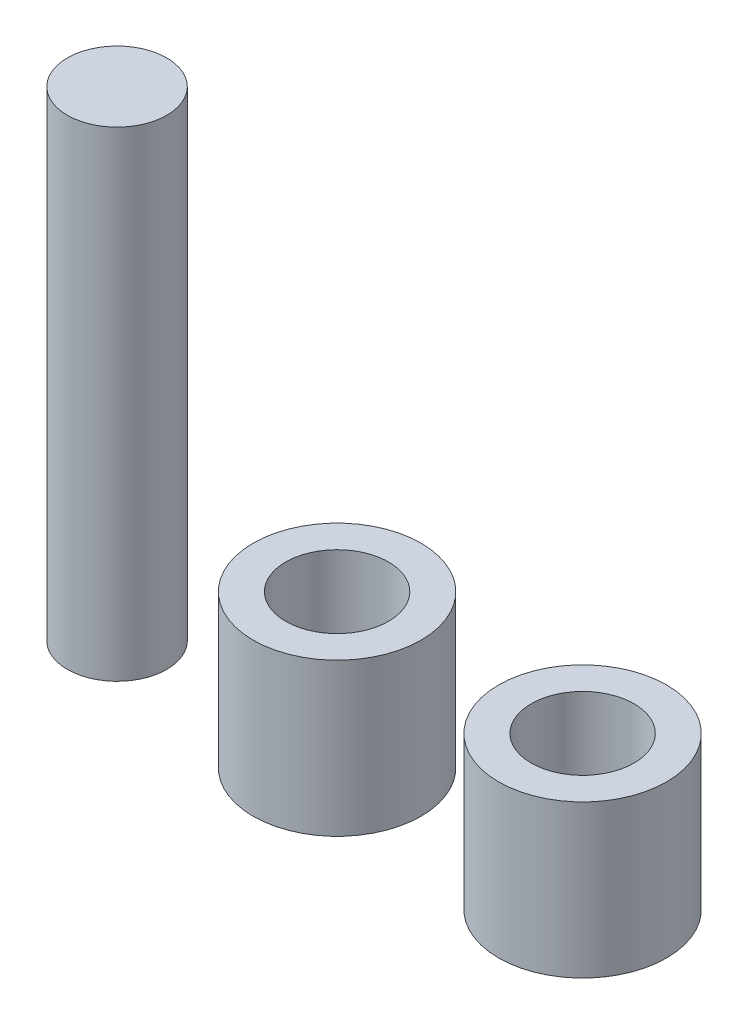
ISO-10303-21;
HEADER;
FILE_DESCRIPTION(('STEP AP214'),'2;1');
FILE_NAME('part.step','',(''),(''),'','','');
FILE_SCHEMA(('AUTOMOTIVE_DESIGN { 1 0 10303 214 1 1 1 1 }'));
ENDSEC;
DATA;
#1=APPLICATION_CONTEXT('core data for automotive mechanical design processes');
#2=APPLICATION_PROTOCOL_DEFINITION('international standard','automotive_design',2000,#1);
#3=PRODUCT_CONTEXT('',#1,'mechanical');
#4=PRODUCT('Part','Part','',(#3));
#5=PRODUCT_RELATED_PRODUCT_CATEGORY('part','',(#4));
#6=PRODUCT_DEFINITION_FORMATION('','',#4);
#7=PRODUCT_DEFINITION_CONTEXT('part definition',#1,'design');
#8=PRODUCT_DEFINITION('design','',#6,#7);
#9=PRODUCT_DEFINITION_SHAPE('','',#8);
#10=(LENGTH_UNIT() NAMED_UNIT(*) SI_UNIT(.MILLI.,.METRE.));
#11=(NAMED_UNIT(*) PLANE_ANGLE_UNIT() SI_UNIT($,.RADIAN.));
#12=(NAMED_UNIT(*) SI_UNIT($,.STERADIAN.) SOLID_ANGLE_UNIT());
#13=UNCERTAINTY_MEASURE_WITH_UNIT(LENGTH_MEASURE(1.E-05),#10,'distance_accuracy_value','');
#14=(GEOMETRIC_REPRESENTATION_CONTEXT(3) GLOBAL_UNCERTAINTY_ASSIGNED_CONTEXT((#13)) GLOBAL_UNIT_ASSIGNED_CONTEXT((#10,
#11,#12)) REPRESENTATION_CONTEXT('',''));
#15=CARTESIAN_POINT('',(0.,0.,0.));
#16=DIRECTION('',(0.,0.,1.));
#17=DIRECTION('',(1.,0.,0.));
#18=AXIS2_PLACEMENT_3D('',#15,#16,#17);
#19=CARTESIAN_POINT('',(13.5808211406265,4.45,0.));
#20=DIRECTION('',(0.,-1.,0.));
#21=DIRECTION('',(0.,0.,-1.));
#22=AXIS2_PLACEMENT_3D('',#19,#20,#21);
#23=CYLINDRICAL_SURFACE('',#22,2.45000000000001);
#24=CARTESIAN_POINT('',(13.5808211406265,4.45,0.));
#25=DIRECTION('',(0.,-1.,0.));
#26=DIRECTION('',(0.,0.,1.));
#27=AXIS2_PLACEMENT_3D('',#24,#25,#26);
#28=CIRCLE('',#27,2.45000000000001);
#29=CARTESIAN_POINT('',(13.5808211406265,4.45,2.45000000000001));
#30=VERTEX_POINT('',#29);
#31=EDGE_CURVE('E11',#30,#30,#28,.T.);
#32=ORIENTED_EDGE('',*,*,#31,.T.);
#33=EDGE_LOOP('',(#32));
#34=FACE_BOUND('',#33,.T.);
#35=CARTESIAN_POINT('',(13.5808211406265,0.,0.));
#36=DIRECTION('',(0.,-1.,0.));
#37=DIRECTION('',(0.,0.,1.));
#38=AXIS2_PLACEMENT_3D('',#35,#36,#37);
#39=CIRCLE('',#38,2.45000000000001);
#40=CARTESIAN_POINT('',(13.5808211406265,0.,2.45000000000001));
#41=VERTEX_POINT('',#40);
#42=EDGE_CURVE('E43',#41,#41,#39,.T.);
#43=ORIENTED_EDGE('',*,*,#42,.F.);
#44=EDGE_LOOP('',(#43));
#45=FACE_BOUND('',#44,.T.);
#46=ADVANCED_FACE('F40',(#34,#45),#23,.T.);
#47=CARTESIAN_POINT('',(13.5808211406265,4.45,0.));
#48=DIRECTION('',(0.,1.,0.));
#49=DIRECTION('',(0.,0.,1.));
#50=AXIS2_PLACEMENT_3D('',#47,#48,#49);
#51=PLANE('',#50);
#52=CARTESIAN_POINT('',(13.5808211406265,4.45,0.));
#53=DIRECTION('',(0.,-1.,0.));
#54=DIRECTION('',(0.,0.,1.));
#55=AXIS2_PLACEMENT_3D('',#52,#53,#54);
#56=CIRCLE('',#55,1.5);
#57=CARTESIAN_POINT('',(13.5808211406265,4.45,1.5));
#58=VERTEX_POINT('',#57);
#59=EDGE_CURVE('E52',#58,#58,#56,.T.);
#60=ORIENTED_EDGE('',*,*,#59,.T.);
#61=EDGE_LOOP('',(#60));
#62=FACE_BOUND('',#61,.T.);
#63=ORIENTED_EDGE('',*,*,#31,.F.);
#64=EDGE_LOOP('',(#63));
#65=FACE_BOUND('',#64,.T.);
#66=ADVANCED_FACE('F64',(#62,#65),#51,.T.);
#67=CARTESIAN_POINT('',(13.5808211406265,0.,0.));
#68=DIRECTION('',(0.,1.,0.));
#69=DIRECTION('',(0.,0.,1.));
#70=AXIS2_PLACEMENT_3D('',#67,#68,#69);
#71=PLANE('',#70);
#72=CARTESIAN_POINT('',(13.5808211406265,0.,0.));
#73=DIRECTION('',(0.,-1.,0.));
#74=DIRECTION('',(0.,0.,1.));
#75=AXIS2_PLACEMENT_3D('',#72,#73,#74);
#76=CIRCLE('',#75,1.5);
#77=CARTESIAN_POINT('',(13.5808211406265,0.,1.5));
#78=VERTEX_POINT('',#77);
#79=EDGE_CURVE('E50',#78,#78,#76,.T.);
#80=ORIENTED_EDGE('',*,*,#79,.F.);
#81=EDGE_LOOP('',(#80));
#82=FACE_BOUND('',#81,.T.);
#83=ORIENTED_EDGE('',*,*,#42,.T.);
#84=EDGE_LOOP('',(#83));
#85=FACE_BOUND('',#84,.T.);
#86=ADVANCED_FACE('F61',(#82,#85),#71,.F.);
#87=CARTESIAN_POINT('',(13.5808211406265,0.,0.));
#88=DIRECTION('',(0.,1.,0.));
#89=DIRECTION('',(0.,0.,1.));
#90=AXIS2_PLACEMENT_3D('',#87,#88,#89);
#91=CYLINDRICAL_SURFACE('',#90,1.5);
#92=ORIENTED_EDGE('',*,*,#79,.T.);
#93=EDGE_LOOP('',(#92));
#94=FACE_BOUND('',#93,.T.);
#95=ORIENTED_EDGE('',*,*,#59,.F.);
#96=EDGE_LOOP('',(#95));
#97=FACE_BOUND('',#96,.T.);
#98=ADVANCED_FACE('F58',(#94,#97),#91,.F.);
#99=CLOSED_SHELL('',(#46,#66,#86,#98));
#100=MANIFOLD_SOLID_BREP('B2',#99);
#101=CARTESIAN_POINT('',(6.41917885937349,4.45,0.));
#102=DIRECTION('',(0.,-1.,0.));
#103=DIRECTION('',(0.,0.,-1.));
#104=AXIS2_PLACEMENT_3D('',#101,#102,#103);
#105=CYLINDRICAL_SURFACE('',#104,2.45000000000001);
#106=CARTESIAN_POINT('',(6.41917885937349,4.45,0.));
#107=DIRECTION('',(0.,1.,0.));
#108=DIRECTION('',(0.,0.,1.));
#109=AXIS2_PLACEMENT_3D('',#106,#107,#108);
#110=CIRCLE('',#109,2.45000000000001);
#111=CARTESIAN_POINT('',(6.41917885937349,4.45,2.45000000000001));
#112=VERTEX_POINT('',#111);
#113=EDGE_CURVE('E39',#112,#112,#110,.T.);
#114=ORIENTED_EDGE('',*,*,#113,.F.);
#115=EDGE_LOOP('',(#114));
#116=FACE_BOUND('',#115,.T.);
#117=CARTESIAN_POINT('',(6.41917885937349,0.,0.));
#118=DIRECTION('',(0.,1.,0.));
#119=DIRECTION('',(0.,0.,1.));
#120=AXIS2_PLACEMENT_3D('',#117,#118,#119);
#121=CIRCLE('',#120,2.45000000000001);
#122=CARTESIAN_POINT('',(6.41917885937349,0.,2.45000000000001));
#123=VERTEX_POINT('',#122);
#124=EDGE_CURVE('E112',#123,#123,#121,.T.);
#125=ORIENTED_EDGE('',*,*,#124,.T.);
#126=EDGE_LOOP('',(#125));
#127=FACE_BOUND('',#126,.T.);
#128=ADVANCED_FACE('F109',(#116,#127),#105,.T.);
#129=CARTESIAN_POINT('',(6.41917885937349,4.45,0.));
#130=DIRECTION('',(0.,1.,0.));
#131=DIRECTION('',(0.,0.,1.));
#132=AXIS2_PLACEMENT_3D('',#129,#130,#131);
#133=PLANE('',#132);
#134=CARTESIAN_POINT('',(6.41917885937349,4.45,0.));
#135=DIRECTION('',(0.,1.,0.));
#136=DIRECTION('',(0.,0.,1.));
#137=AXIS2_PLACEMENT_3D('',#134,#135,#136);
#138=CIRCLE('',#137,1.5);
#139=CARTESIAN_POINT('',(6.41917885937349,4.45,1.5));
#140=VERTEX_POINT('',#139);
#141=EDGE_CURVE('E121',#140,#140,#138,.T.);
#142=ORIENTED_EDGE('',*,*,#141,.F.);
#143=EDGE_LOOP('',(#142));
#144=FACE_BOUND('',#143,.T.);
#145=ORIENTED_EDGE('',*,*,#113,.T.);
#146=EDGE_LOOP('',(#145));
#147=FACE_BOUND('',#146,.T.);
#148=ADVANCED_FACE('F136',(#144,#147),#133,.T.);
#149=CARTESIAN_POINT('',(6.41917885937349,0.,0.));
#150=DIRECTION('',(0.,1.,0.));
#151=DIRECTION('',(0.,0.,1.));
#152=AXIS2_PLACEMENT_3D('',#149,#150,#151);
#153=PLANE('',#152);
#154=CARTESIAN_POINT('',(6.41917885937349,0.,0.));
#155=DIRECTION('',(0.,1.,0.));
#156=DIRECTION('',(0.,0.,1.));
#157=AXIS2_PLACEMENT_3D('',#154,#155,#156);
#158=CIRCLE('',#157,1.5);
#159=CARTESIAN_POINT('',(6.41917885937349,0.,1.5));
#160=VERTEX_POINT('',#159);
#161=EDGE_CURVE('E119',#160,#160,#158,.T.);
#162=ORIENTED_EDGE('',*,*,#161,.T.);
#163=EDGE_LOOP('',(#162));
#164=FACE_BOUND('',#163,.T.);
#165=ORIENTED_EDGE('',*,*,#124,.F.);
#166=EDGE_LOOP('',(#165));
#167=FACE_BOUND('',#166,.T.);
#168=ADVANCED_FACE('F127',(#164,#167),#153,.F.);
#169=CARTESIAN_POINT('',(6.41917885937349,0.,0.));
#170=DIRECTION('',(0.,1.,0.));
#171=DIRECTION('',(0.,0.,1.));
#172=AXIS2_PLACEMENT_3D('',#169,#170,#171);
#173=CYLINDRICAL_SURFACE('',#172,1.5);
#174=ORIENTED_EDGE('',*,*,#161,.F.);
#175=EDGE_LOOP('',(#174));
#176=FACE_BOUND('',#175,.T.);
#177=ORIENTED_EDGE('',*,*,#141,.T.);
#178=EDGE_LOOP('',(#177));
#179=FACE_BOUND('',#178,.T.);
#180=ADVANCED_FACE('F130',(#176,#179),#173,.F.);
#181=CLOSED_SHELL('',(#128,#148,#168,#180));
#182=MANIFOLD_SOLID_BREP('B6',#181);
#183=CARTESIAN_POINT('',(0.,14.,0.));
#184=DIRECTION('',(0.,-1.,0.));
#185=DIRECTION('',(0.,0.,-1.));
#186=AXIS2_PLACEMENT_3D('',#183,#184,#185);
#187=CYLINDRICAL_SURFACE('',#186,1.45);
#188=CARTESIAN_POINT('',(0.,14.,0.));
#189=DIRECTION('',(0.,1.,0.));
#190=DIRECTION('',(0.,0.,1.));
#191=AXIS2_PLACEMENT_3D('',#188,#189,#190);
#192=CIRCLE('',#191,1.45);
#193=CARTESIAN_POINT('',(0.,14.,1.45));
#194=VERTEX_POINT('',#193);
#195=EDGE_CURVE('E108',#194,#194,#192,.T.);
#196=ORIENTED_EDGE('',*,*,#195,.F.);
#197=EDGE_LOOP('',(#196));
#198=FACE_BOUND('',#197,.T.);
#199=CARTESIAN_POINT('',(0.,0.,0.));
#200=DIRECTION('',(0.,1.,0.));
#201=DIRECTION('',(0.,0.,1.));
#202=AXIS2_PLACEMENT_3D('',#199,#200,#201);
#203=CIRCLE('',#202,1.45);
#204=CARTESIAN_POINT('',(0.,0.,1.45));
#205=VERTEX_POINT('',#204);
#206=EDGE_CURVE('E174',#205,#205,#203,.T.);
#207=ORIENTED_EDGE('',*,*,#206,.T.);
#208=EDGE_LOOP('',(#207));
#209=FACE_BOUND('',#208,.T.);
#210=ADVANCED_FACE('F171',(#198,#209),#187,.T.);
#211=CARTESIAN_POINT('',(0.,14.,0.));
#212=DIRECTION('',(0.,1.,0.));
#213=DIRECTION('',(0.,0.,1.));
#214=AXIS2_PLACEMENT_3D('',#211,#212,#213);
#215=PLANE('',#214);
#216=ORIENTED_EDGE('',*,*,#195,.T.);
#217=EDGE_LOOP('',(#216));
#218=FACE_BOUND('',#217,.T.);
#219=ADVANCED_FACE('F186',(#218),#215,.T.);
#220=CARTESIAN_POINT('',(0.,0.,0.));
#221=DIRECTION('',(0.,1.,0.));
#222=DIRECTION('',(0.,0.,1.));
#223=AXIS2_PLACEMENT_3D('',#220,#221,#222);
#224=PLANE('',#223);
#225=ORIENTED_EDGE('',*,*,#206,.F.);
#226=EDGE_LOOP('',(#225));
#227=FACE_BOUND('',#226,.T.);
#228=ADVANCED_FACE('F184',(#227),#224,.F.);
#229=CLOSED_SHELL('',(#210,#219,#228));
#230=MANIFOLD_SOLID_BREP('B34',#229);
#231=ADVANCED_BREP_SHAPE_REPRESENTATION('',(#18,#100,#182,#230),#14);
#232=SHAPE_DEFINITION_REPRESENTATION(#9,#231);
ENDSEC;
END-ISO-10303-21;
